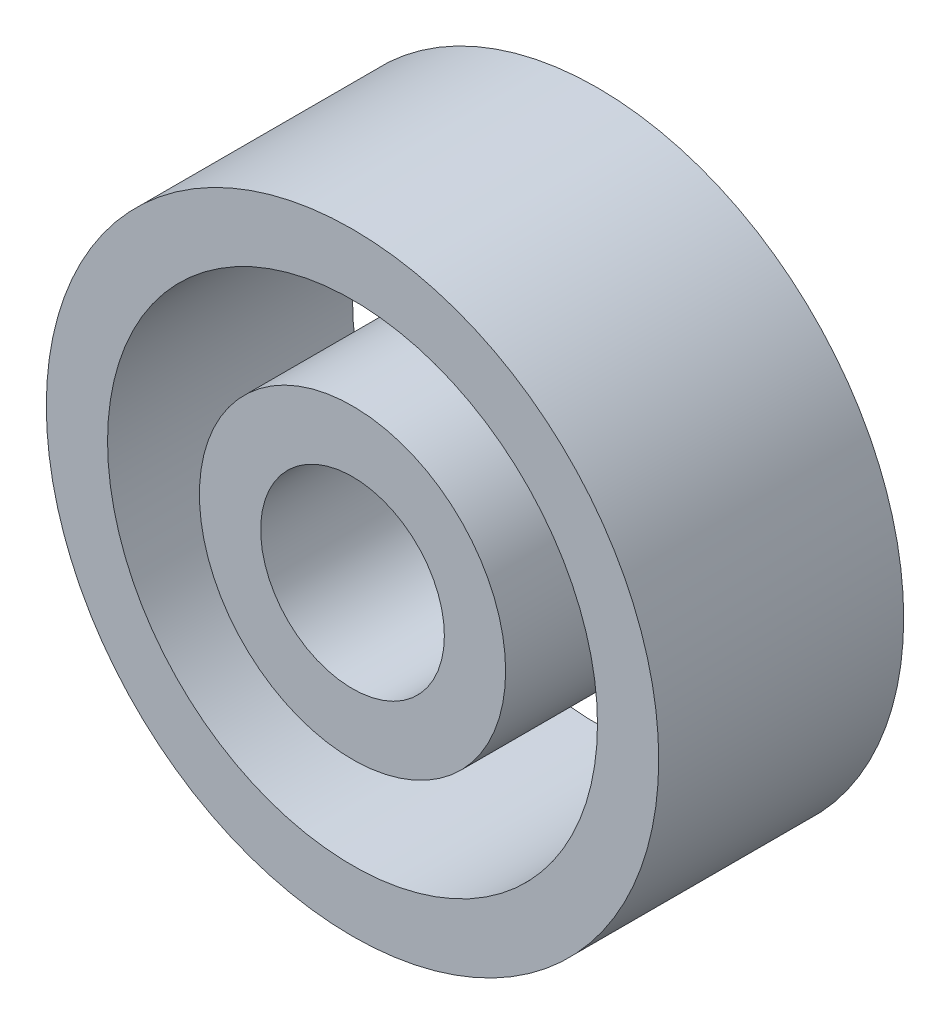
ISO-10303-21;
HEADER;
FILE_DESCRIPTION(('STEP AP214'),'2;1');
FILE_NAME('part.step','',(''),(''),'','','');
FILE_SCHEMA(('AUTOMOTIVE_DESIGN { 1 0 10303 214 1 1 1 1 }'));
ENDSEC;
DATA;
#1=APPLICATION_CONTEXT('core data for automotive mechanical design processes');
#2=APPLICATION_PROTOCOL_DEFINITION('international standard','automotive_design',2000,#1);
#3=PRODUCT_CONTEXT('',#1,'mechanical');
#4=PRODUCT('Part','Part','',(#3));
#5=PRODUCT_RELATED_PRODUCT_CATEGORY('part','',(#4));
#6=PRODUCT_DEFINITION_FORMATION('','',#4);
#7=PRODUCT_DEFINITION_CONTEXT('part definition',#1,'design');
#8=PRODUCT_DEFINITION('design','',#6,#7);
#9=PRODUCT_DEFINITION_SHAPE('','',#8);
#10=(LENGTH_UNIT() NAMED_UNIT(*) SI_UNIT(.MILLI.,.METRE.));
#11=(NAMED_UNIT(*) PLANE_ANGLE_UNIT() SI_UNIT($,.RADIAN.));
#12=(NAMED_UNIT(*) SI_UNIT($,.STERADIAN.) SOLID_ANGLE_UNIT());
#13=UNCERTAINTY_MEASURE_WITH_UNIT(LENGTH_MEASURE(1.E-05),#10,'distance_accuracy_value','');
#14=(GEOMETRIC_REPRESENTATION_CONTEXT(3) GLOBAL_UNCERTAINTY_ASSIGNED_CONTEXT((#13)) GLOBAL_UNIT_ASSIGNED_CONTEXT((#10,
#11,#12)) REPRESENTATION_CONTEXT('',''));
#15=CARTESIAN_POINT('',(0.,0.,0.));
#16=DIRECTION('',(0.,0.,1.));
#17=DIRECTION('',(1.,0.,0.));
#18=AXIS2_PLACEMENT_3D('',#15,#16,#17);
#19=CARTESIAN_POINT('',(0.,0.,2.));
#20=DIRECTION('',(0.,0.,1.));
#21=DIRECTION('',(1.,0.,0.));
#22=AXIS2_PLACEMENT_3D('',#19,#20,#21);
#23=PLANE('',#22);
#24=CARTESIAN_POINT('',(0.,0.,2.));
#25=DIRECTION('',(0.,0.,1.));
#26=DIRECTION('',(1.,0.,0.));
#27=AXIS2_PLACEMENT_3D('',#24,#25,#26);
#28=CIRCLE('',#27,2.5);
#29=CARTESIAN_POINT('',(2.5,0.,2.));
#30=VERTEX_POINT('',#29);
#31=EDGE_CURVE('E11',#30,#30,#28,.T.);
#32=ORIENTED_EDGE('',*,*,#31,.T.);
#33=EDGE_LOOP('',(#32));
#34=FACE_BOUND('',#33,.T.);
#35=CARTESIAN_POINT('',(0.,0.,2.));
#36=DIRECTION('',(0.,0.,1.));
#37=DIRECTION('',(1.,0.,0.));
#38=AXIS2_PLACEMENT_3D('',#35,#36,#37);
#39=CIRCLE('',#38,1.5);
#40=CARTESIAN_POINT('',(1.5,0.,2.));
#41=VERTEX_POINT('',#40);
#42=EDGE_CURVE('E62',#41,#41,#39,.T.);
#43=ORIENTED_EDGE('',*,*,#42,.F.);
#44=EDGE_LOOP('',(#43));
#45=FACE_BOUND('',#44,.T.);
#46=ADVANCED_FACE('F52',(#34,#45),#23,.T.);
#47=CARTESIAN_POINT('',(0.,0.,-2.));
#48=DIRECTION('',(0.,0.,1.));
#49=DIRECTION('',(1.,0.,0.));
#50=AXIS2_PLACEMENT_3D('',#47,#48,#49);
#51=PLANE('',#50);
#52=CARTESIAN_POINT('',(0.,0.,-2.));
#53=DIRECTION('',(0.,0.,1.));
#54=DIRECTION('',(1.,0.,0.));
#55=AXIS2_PLACEMENT_3D('',#52,#53,#54);
#56=CIRCLE('',#55,2.5);
#57=CARTESIAN_POINT('',(2.5,0.,-2.));
#58=VERTEX_POINT('',#57);
#59=EDGE_CURVE('E60',#58,#58,#56,.T.);
#60=ORIENTED_EDGE('',*,*,#59,.F.);
#61=EDGE_LOOP('',(#60));
#62=FACE_BOUND('',#61,.T.);
#63=CARTESIAN_POINT('',(0.,0.,-2.));
#64=DIRECTION('',(0.,0.,1.));
#65=DIRECTION('',(1.,0.,0.));
#66=AXIS2_PLACEMENT_3D('',#63,#64,#65);
#67=CIRCLE('',#66,1.5);
#68=CARTESIAN_POINT('',(1.5,0.,-2.));
#69=VERTEX_POINT('',#68);
#70=EDGE_CURVE('E67',#69,#69,#67,.T.);
#71=ORIENTED_EDGE('',*,*,#70,.T.);
#72=EDGE_LOOP('',(#71));
#73=FACE_BOUND('',#72,.T.);
#74=ADVANCED_FACE('F78',(#62,#73),#51,.F.);
#75=CARTESIAN_POINT('',(0.,0.,2.));
#76=DIRECTION('',(0.,0.,-1.));
#77=DIRECTION('',(-1.,0.,0.));
#78=AXIS2_PLACEMENT_3D('',#75,#76,#77);
#79=CYLINDRICAL_SURFACE('',#78,2.5);
#80=ORIENTED_EDGE('',*,*,#31,.F.);
#81=EDGE_LOOP('',(#80));
#82=FACE_BOUND('',#81,.T.);
#83=ORIENTED_EDGE('',*,*,#59,.T.);
#84=EDGE_LOOP('',(#83));
#85=FACE_BOUND('',#84,.T.);
#86=ADVANCED_FACE('F54',(#82,#85),#79,.T.);
#87=CARTESIAN_POINT('',(0.,0.,2.));
#88=DIRECTION('',(0.,0.,-1.));
#89=DIRECTION('',(-1.,0.,0.));
#90=AXIS2_PLACEMENT_3D('',#87,#88,#89);
#91=CYLINDRICAL_SURFACE('',#90,1.5);
#92=ORIENTED_EDGE('',*,*,#42,.T.);
#93=EDGE_LOOP('',(#92));
#94=FACE_BOUND('',#93,.T.);
#95=ORIENTED_EDGE('',*,*,#70,.F.);
#96=EDGE_LOOP('',(#95));
#97=FACE_BOUND('',#96,.T.);
#98=ADVANCED_FACE('F75',(#94,#97),#91,.F.);
#99=CLOSED_SHELL('',(#46,#74,#86,#98));
#100=MANIFOLD_SOLID_BREP('B2',#99);
#101=CARTESIAN_POINT('',(0.,0.,2.));
#102=DIRECTION('',(0.,0.,1.));
#103=DIRECTION('',(1.,0.,0.));
#104=AXIS2_PLACEMENT_3D('',#101,#102,#103);
#105=PLANE('',#104);
#106=CARTESIAN_POINT('',(0.,0.,2.));
#107=DIRECTION('',(0.,0.,1.));
#108=DIRECTION('',(1.,0.,0.));
#109=AXIS2_PLACEMENT_3D('',#106,#107,#108);
#110=CIRCLE('',#109,5.);
#111=CARTESIAN_POINT('',(5.,0.,2.));
#112=VERTEX_POINT('',#111);
#113=EDGE_CURVE('E55',#112,#112,#110,.T.);
#114=ORIENTED_EDGE('',*,*,#113,.T.);
#115=EDGE_LOOP('',(#114));
#116=FACE_BOUND('',#115,.T.);
#117=CARTESIAN_POINT('',(0.,0.,2.));
#118=DIRECTION('',(0.,0.,1.));
#119=DIRECTION('',(1.,0.,0.));
#120=AXIS2_PLACEMENT_3D('',#117,#118,#119);
#121=CIRCLE('',#120,4.);
#122=CARTESIAN_POINT('',(4.,0.,2.));
#123=VERTEX_POINT('',#122);
#124=EDGE_CURVE('E130',#123,#123,#121,.T.);
#125=ORIENTED_EDGE('',*,*,#124,.F.);
#126=EDGE_LOOP('',(#125));
#127=FACE_BOUND('',#126,.T.);
#128=ADVANCED_FACE('F113',(#116,#127),#105,.T.);
#129=CARTESIAN_POINT('',(0.,0.,-2.));
#130=DIRECTION('',(0.,0.,1.));
#131=DIRECTION('',(1.,0.,0.));
#132=AXIS2_PLACEMENT_3D('',#129,#130,#131);
#133=PLANE('',#132);
#134=CARTESIAN_POINT('',(0.,0.,-2.));
#135=DIRECTION('',(0.,0.,1.));
#136=DIRECTION('',(1.,0.,0.));
#137=AXIS2_PLACEMENT_3D('',#134,#135,#136);
#138=CIRCLE('',#137,5.);
#139=CARTESIAN_POINT('',(5.,0.,-2.));
#140=VERTEX_POINT('',#139);
#141=EDGE_CURVE('E119',#140,#140,#138,.T.);
#142=ORIENTED_EDGE('',*,*,#141,.F.);
#143=EDGE_LOOP('',(#142));
#144=FACE_BOUND('',#143,.T.);
#145=CARTESIAN_POINT('',(0.,0.,-2.));
#146=DIRECTION('',(0.,0.,1.));
#147=DIRECTION('',(1.,0.,0.));
#148=AXIS2_PLACEMENT_3D('',#145,#146,#147);
#149=CIRCLE('',#148,4.);
#150=CARTESIAN_POINT('',(4.,0.,-2.));
#151=VERTEX_POINT('',#150);
#152=EDGE_CURVE('E129',#151,#151,#149,.T.);
#153=ORIENTED_EDGE('',*,*,#152,.T.);
#154=EDGE_LOOP('',(#153));
#155=FACE_BOUND('',#154,.T.);
#156=ADVANCED_FACE('F136',(#144,#155),#133,.F.);
#157=CARTESIAN_POINT('',(0.,0.,2.));
#158=DIRECTION('',(0.,0.,-1.));
#159=DIRECTION('',(-1.,0.,0.));
#160=AXIS2_PLACEMENT_3D('',#157,#158,#159);
#161=CYLINDRICAL_SURFACE('',#160,5.);
#162=ORIENTED_EDGE('',*,*,#113,.F.);
#163=EDGE_LOOP('',(#162));
#164=FACE_BOUND('',#163,.T.);
#165=ORIENTED_EDGE('',*,*,#141,.T.);
#166=EDGE_LOOP('',(#165));
#167=FACE_BOUND('',#166,.T.);
#168=ADVANCED_FACE('F116',(#164,#167),#161,.T.);
#169=CARTESIAN_POINT('',(0.,0.,2.));
#170=DIRECTION('',(0.,0.,-1.));
#171=DIRECTION('',(-1.,0.,0.));
#172=AXIS2_PLACEMENT_3D('',#169,#170,#171);
#173=CYLINDRICAL_SURFACE('',#172,4.);
#174=ORIENTED_EDGE('',*,*,#124,.T.);
#175=EDGE_LOOP('',(#174));
#176=FACE_BOUND('',#175,.T.);
#177=ORIENTED_EDGE('',*,*,#152,.F.);
#178=EDGE_LOOP('',(#177));
#179=FACE_BOUND('',#178,.T.);
#180=ADVANCED_FACE('F134',(#176,#179),#173,.F.);
#181=CLOSED_SHELL('',(#128,#156,#168,#180));
#182=MANIFOLD_SOLID_BREP('B6',#181);
#183=ADVANCED_BREP_SHAPE_REPRESENTATION('',(#18,#100,#182),#14);
#184=SHAPE_DEFINITION_REPRESENTATION(#9,#183);
ENDSEC;
END-ISO-10303-21;
